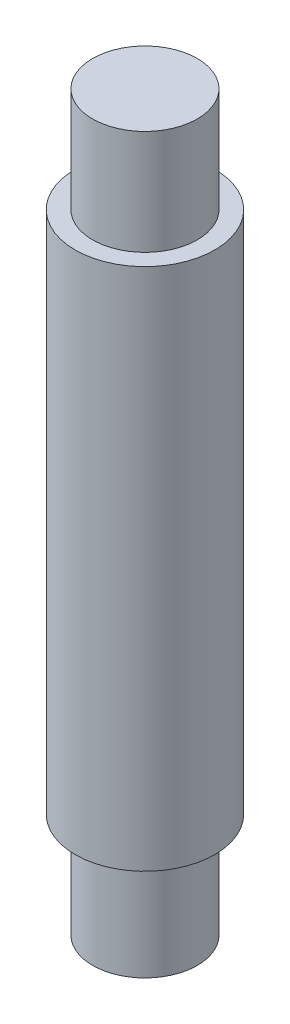
ISO-10303-21;
HEADER;
FILE_DESCRIPTION(('STEP AP214'),'2;1');
FILE_NAME('part.step','',(''),(''),'','','');
FILE_SCHEMA(('AUTOMOTIVE_DESIGN { 1 0 10303 214 1 1 1 1 }'));
ENDSEC;
DATA;
#1=APPLICATION_CONTEXT('core data for automotive mechanical design processes');
#2=APPLICATION_PROTOCOL_DEFINITION('international standard','automotive_design',2000,#1);
#3=PRODUCT_CONTEXT('',#1,'mechanical');
#4=PRODUCT('Part','Part','',(#3));
#5=PRODUCT_RELATED_PRODUCT_CATEGORY('part','',(#4));
#6=PRODUCT_DEFINITION_FORMATION('','',#4);
#7=PRODUCT_DEFINITION_CONTEXT('part definition',#1,'design');
#8=PRODUCT_DEFINITION('design','',#6,#7);
#9=PRODUCT_DEFINITION_SHAPE('','',#8);
#10=(LENGTH_UNIT() NAMED_UNIT(*) SI_UNIT(.MILLI.,.METRE.));
#11=(NAMED_UNIT(*) PLANE_ANGLE_UNIT() SI_UNIT($,.RADIAN.));
#12=(NAMED_UNIT(*) SI_UNIT($,.STERADIAN.) SOLID_ANGLE_UNIT());
#13=UNCERTAINTY_MEASURE_WITH_UNIT(LENGTH_MEASURE(1.E-05),#10,'distance_accuracy_value','');
#14=(GEOMETRIC_REPRESENTATION_CONTEXT(3) GLOBAL_UNCERTAINTY_ASSIGNED_CONTEXT((#13)) GLOBAL_UNIT_ASSIGNED_CONTEXT((#10,
#11,#12)) REPRESENTATION_CONTEXT('',''));
#15=CARTESIAN_POINT('',(0.,0.,0.));
#16=DIRECTION('',(0.,0.,1.));
#17=DIRECTION('',(1.,0.,0.));
#18=AXIS2_PLACEMENT_3D('',#15,#16,#17);
#19=CARTESIAN_POINT('',(0.,152.4,0.));
#20=DIRECTION('',(0.,-1.,0.));
#21=DIRECTION('',(0.,0.,-1.));
#22=AXIS2_PLACEMENT_3D('',#19,#20,#21);
#23=CYLINDRICAL_SURFACE('',#22,76.2);
#24=CARTESIAN_POINT('',(0.,152.4,0.));
#25=DIRECTION('',(0.,1.,0.));
#26=DIRECTION('',(0.,0.,1.));
#27=AXIS2_PLACEMENT_3D('',#24,#25,#26);
#28=CIRCLE('',#27,76.2);
#29=CARTESIAN_POINT('',(0.,152.4,-76.2));
#30=VERTEX_POINT('',#29);
#31=EDGE_CURVE('E40',#30,#30,#28,.T.);
#32=CARTESIAN_POINT('',(0.,0.,0.));
#33=DIRECTION('',(0.,1.,0.));
#34=DIRECTION('',(0.,0.,1.));
#35=AXIS2_PLACEMENT_3D('',#32,#33,#34);
#36=CIRCLE('',#35,76.2);
#37=CARTESIAN_POINT('',(0.,0.,-76.2));
#38=VERTEX_POINT('',#37);
#39=EDGE_CURVE('E36',#38,#38,#36,.T.);
#40=CARTESIAN_POINT('',(0.,152.4,-76.2));
#41=CARTESIAN_POINT('',(0.,150.8125,-76.2));
#42=CARTESIAN_POINT('',(0.,149.225,-76.2));
#43=CARTESIAN_POINT('',(0.,146.05,-76.2));
#44=CARTESIAN_POINT('',(0.,144.4625,-76.2));
#45=CARTESIAN_POINT('',(0.,141.2875,-76.2));
#46=CARTESIAN_POINT('',(0.,139.7,-76.2));
#47=CARTESIAN_POINT('',(0.,136.525,-76.2));
#48=CARTESIAN_POINT('',(0.,134.9375,-76.2));
#49=CARTESIAN_POINT('',(0.,131.7625,-76.2));
#50=CARTESIAN_POINT('',(0.,130.175,-76.2));
#51=CARTESIAN_POINT('',(0.,127.,-76.2));
#52=CARTESIAN_POINT('',(0.,125.4125,-76.2));
#53=CARTESIAN_POINT('',(0.,122.2375,-76.2));
#54=CARTESIAN_POINT('',(0.,120.65,-76.2));
#55=CARTESIAN_POINT('',(0.,117.475,-76.2));
#56=CARTESIAN_POINT('',(0.,115.8875,-76.2));
#57=CARTESIAN_POINT('',(0.,112.7125,-76.2));
#58=CARTESIAN_POINT('',(0.,111.125,-76.2));
#59=CARTESIAN_POINT('',(0.,107.95,-76.2));
#60=CARTESIAN_POINT('',(0.,106.3625,-76.2));
#61=CARTESIAN_POINT('',(0.,103.1875,-76.2));
#62=CARTESIAN_POINT('',(0.,101.6,-76.2));
#63=CARTESIAN_POINT('',(0.,98.425,-76.2));
#64=CARTESIAN_POINT('',(0.,96.8375,-76.2));
#65=CARTESIAN_POINT('',(0.,93.6625,-76.2));
#66=CARTESIAN_POINT('',(0.,92.075,-76.2));
#67=CARTESIAN_POINT('',(0.,88.9,-76.2));
#68=CARTESIAN_POINT('',(0.,87.3125,-76.2));
#69=CARTESIAN_POINT('',(0.,84.1375,-76.2));
#70=CARTESIAN_POINT('',(0.,82.55,-76.2));
#71=CARTESIAN_POINT('',(0.,79.375,-76.2));
#72=CARTESIAN_POINT('',(0.,77.7875,-76.2));
#73=CARTESIAN_POINT('',(0.,74.6125,-76.2));
#74=CARTESIAN_POINT('',(0.,73.025,-76.2));
#75=CARTESIAN_POINT('',(0.,69.85,-76.2));
#76=CARTESIAN_POINT('',(0.,68.2625,-76.2));
#77=CARTESIAN_POINT('',(0.,65.0875,-76.2));
#78=CARTESIAN_POINT('',(0.,63.5,-76.2));
#79=CARTESIAN_POINT('',(0.,60.325,-76.2));
#80=CARTESIAN_POINT('',(0.,58.7375,-76.2));
#81=CARTESIAN_POINT('',(0.,55.5625,-76.2));
#82=CARTESIAN_POINT('',(0.,53.975,-76.2));
#83=CARTESIAN_POINT('',(0.,50.8,-76.2));
#84=CARTESIAN_POINT('',(0.,49.2125,-76.2));
#85=CARTESIAN_POINT('',(0.,46.0375,-76.2));
#86=CARTESIAN_POINT('',(0.,44.45,-76.2));
#87=CARTESIAN_POINT('',(0.,41.275,-76.2));
#88=CARTESIAN_POINT('',(0.,39.6875,-76.2));
#89=CARTESIAN_POINT('',(0.,36.5125,-76.2));
#90=CARTESIAN_POINT('',(0.,34.925,-76.2));
#91=CARTESIAN_POINT('',(0.,31.75,-76.2));
#92=CARTESIAN_POINT('',(0.,30.1625,-76.2));
#93=CARTESIAN_POINT('',(0.,26.9875,-76.2));
#94=CARTESIAN_POINT('',(0.,25.4,-76.2));
#95=CARTESIAN_POINT('',(0.,22.225,-76.2));
#96=CARTESIAN_POINT('',(0.,20.6375,-76.2));
#97=CARTESIAN_POINT('',(0.,17.4625,-76.2));
#98=CARTESIAN_POINT('',(0.,15.875,-76.2));
#99=CARTESIAN_POINT('',(0.,12.7,-76.2));
#100=CARTESIAN_POINT('',(0.,11.1125,-76.2));
#101=CARTESIAN_POINT('',(0.,7.93750000000001,-76.2));
#102=CARTESIAN_POINT('',(0.,6.35,-76.2));
#103=CARTESIAN_POINT('',(0.,3.175,-76.2));
#104=CARTESIAN_POINT('',(0.,1.5875,-76.2));
#105=CARTESIAN_POINT('',(0.,0.,-76.2));
#106=B_SPLINE_CURVE_WITH_KNOTS('',3,(#40,#41,#42,#43,#44,#45,#46,#47,#48,#49,#50,#51,#52,#53,
#54,#55,#56,#57,#58,#59,#60,#61,#62,#63,#64,#65,#66,#67,#68,#69,#70,#71,#72,#73,#74,#75,#76,#77,
#78,#79,#80,#81,#82,#83,#84,#85,#86,#87,#88,#89,#90,#91,#92,#93,#94,#95,#96,#97,#98,#99,#100,
#101,#102,#103,#104,#105),.UNSPECIFIED.,.F.,.F.,(4,2,2,2,2,2,2,2,2,2,2,2,2,2,2,2,2,2,2,2,2,2,2,
2,2,2,2,2,2,2,2,2,4),(0.,4.7625,9.52500000000001,14.2875,19.05,23.8125,28.575,33.3375,38.1,
42.8625,47.625,52.3875,57.15,61.9125,66.675,71.4375,76.2,80.9625,85.725,90.4875,95.25,100.0125,
104.775,109.5375,114.3,119.0625,123.825,128.5875,133.35,138.1125,142.875,147.6375,152.4),.UNSPECIFIED.);
#107=EDGE_CURVE('BSEAM33',#30,#38,#106,.T.);
#108=ORIENTED_EDGE('',*,*,#31,.F.);
#109=ORIENTED_EDGE('',*,*,#39,.T.);
#110=ORIENTED_EDGE('',*,*,#107,.T.);
#111=ORIENTED_EDGE('',*,*,#107,.F.);
#112=EDGE_LOOP('',(#108,#110,#109,#111));
#113=FACE_BOUND('',#112,.T.);
#114=ADVANCED_FACE('F33',(#113),#23,.T.);
#115=CARTESIAN_POINT('',(0.,0.,0.));
#116=DIRECTION('',(0.,1.,0.));
#117=DIRECTION('',(0.,0.,1.));
#118=AXIS2_PLACEMENT_3D('',#115,#116,#117);
#119=PLANE('',#118);
#120=ORIENTED_EDGE('',*,*,#39,.F.);
#121=EDGE_LOOP('',(#120));
#122=FACE_BOUND('',#121,.T.);
#123=ADVANCED_FACE('F74',(#122),#119,.F.);
#124=CARTESIAN_POINT('',(0.,914.4,0.));
#125=DIRECTION('',(0.,-1.,0.));
#126=DIRECTION('',(0.,0.,-1.));
#127=AXIS2_PLACEMENT_3D('',#124,#125,#126);
#128=CYLINDRICAL_SURFACE('',#127,101.6);
#129=CARTESIAN_POINT('',(0.,914.4,0.));
#130=DIRECTION('',(0.,1.,0.));
#131=DIRECTION('',(0.,0.,1.));
#132=AXIS2_PLACEMENT_3D('',#129,#130,#131);
#133=CIRCLE('',#132,101.6);
#134=CARTESIAN_POINT('',(0.,914.4,101.6));
#135=VERTEX_POINT('',#134);
#136=EDGE_CURVE('E48',#135,#135,#133,.T.);
#137=ORIENTED_EDGE('',*,*,#136,.F.);
#138=EDGE_LOOP('',(#137));
#139=FACE_BOUND('',#138,.T.);
#140=CARTESIAN_POINT('',(0.,152.4,0.));
#141=DIRECTION('',(0.,1.,0.));
#142=DIRECTION('',(0.,0.,1.));
#143=AXIS2_PLACEMENT_3D('',#140,#141,#142);
#144=CIRCLE('',#143,101.6);
#145=CARTESIAN_POINT('',(0.,152.4,101.6));
#146=VERTEX_POINT('',#145);
#147=EDGE_CURVE('E51',#146,#146,#144,.T.);
#148=ORIENTED_EDGE('',*,*,#147,.T.);
#149=EDGE_LOOP('',(#148));
#150=FACE_BOUND('',#149,.T.);
#151=ADVANCED_FACE('F79',(#139,#150),#128,.T.);
#152=CARTESIAN_POINT('',(0.,914.4,0.));
#153=DIRECTION('',(0.,1.,0.));
#154=DIRECTION('',(0.,0.,1.));
#155=AXIS2_PLACEMENT_3D('',#152,#153,#154);
#156=PLANE('',#155);
#157=CARTESIAN_POINT('',(0.,914.4,0.));
#158=DIRECTION('',(0.,1.,0.));
#159=DIRECTION('',(0.,0.,1.));
#160=AXIS2_PLACEMENT_3D('',#157,#158,#159);
#161=CIRCLE('',#160,76.2);
#162=CARTESIAN_POINT('',(0.,914.4,-76.2));
#163=VERTEX_POINT('',#162);
#164=EDGE_CURVE('E10',#163,#163,#161,.T.);
#165=ORIENTED_EDGE('',*,*,#164,.F.);
#166=EDGE_LOOP('',(#165));
#167=FACE_BOUND('',#166,.T.);
#168=ORIENTED_EDGE('',*,*,#136,.T.);
#169=EDGE_LOOP('',(#168));
#170=FACE_BOUND('',#169,.T.);
#171=ADVANCED_FACE('F69',(#167,#170),#156,.T.);
#172=CARTESIAN_POINT('',(0.,152.4,0.));
#173=DIRECTION('',(0.,1.,0.));
#174=DIRECTION('',(0.,0.,1.));
#175=AXIS2_PLACEMENT_3D('',#172,#173,#174);
#176=PLANE('',#175);
#177=ORIENTED_EDGE('',*,*,#31,.T.);
#178=EDGE_LOOP('',(#177));
#179=FACE_BOUND('',#178,.T.);
#180=ORIENTED_EDGE('',*,*,#147,.F.);
#181=EDGE_LOOP('',(#180));
#182=FACE_BOUND('',#181,.T.);
#183=ADVANCED_FACE('F62',(#179,#182),#176,.F.);
#184=CARTESIAN_POINT('',(0.,1066.8,0.));
#185=DIRECTION('',(0.,-1.,0.));
#186=DIRECTION('',(0.,0.,-1.));
#187=AXIS2_PLACEMENT_3D('',#184,#185,#186);
#188=CYLINDRICAL_SURFACE('',#187,76.2);
#189=CARTESIAN_POINT('',(0.,1066.8,0.));
#190=DIRECTION('',(0.,1.,0.));
#191=DIRECTION('',(0.,0.,1.));
#192=AXIS2_PLACEMENT_3D('',#189,#190,#191);
#193=CIRCLE('',#192,76.2);
#194=CARTESIAN_POINT('',(0.,1066.8,-76.2));
#195=VERTEX_POINT('',#194);
#196=EDGE_CURVE('E47',#195,#195,#193,.T.);
#197=CARTESIAN_POINT('',(0.,1066.8,-76.2));
#198=CARTESIAN_POINT('',(0.,1065.2125,-76.2));
#199=CARTESIAN_POINT('',(0.,1063.625,-76.2));
#200=CARTESIAN_POINT('',(0.,1060.45,-76.2));
#201=CARTESIAN_POINT('',(0.,1058.8625,-76.2));
#202=CARTESIAN_POINT('',(0.,1055.6875,-76.2));
#203=CARTESIAN_POINT('',(0.,1054.1,-76.2));
#204=CARTESIAN_POINT('',(0.,1050.925,-76.2));
#205=CARTESIAN_POINT('',(0.,1049.3375,-76.2));
#206=CARTESIAN_POINT('',(0.,1046.1625,-76.2));
#207=CARTESIAN_POINT('',(0.,1044.575,-76.2));
#208=CARTESIAN_POINT('',(0.,1041.4,-76.2));
#209=CARTESIAN_POINT('',(0.,1039.8125,-76.2));
#210=CARTESIAN_POINT('',(0.,1036.6375,-76.2));
#211=CARTESIAN_POINT('',(0.,1035.05,-76.2));
#212=CARTESIAN_POINT('',(0.,1031.875,-76.2));
#213=CARTESIAN_POINT('',(0.,1030.2875,-76.2));
#214=CARTESIAN_POINT('',(0.,1027.1125,-76.2));
#215=CARTESIAN_POINT('',(0.,1025.525,-76.2));
#216=CARTESIAN_POINT('',(0.,1022.35,-76.2));
#217=CARTESIAN_POINT('',(0.,1020.7625,-76.2));
#218=CARTESIAN_POINT('',(0.,1017.5875,-76.2));
#219=CARTESIAN_POINT('',(0.,1016.,-76.2));
#220=CARTESIAN_POINT('',(0.,1012.825,-76.2));
#221=CARTESIAN_POINT('',(0.,1011.2375,-76.2));
#222=CARTESIAN_POINT('',(0.,1008.0625,-76.2));
#223=CARTESIAN_POINT('',(0.,1006.475,-76.2));
#224=CARTESIAN_POINT('',(0.,1003.3,-76.2));
#225=CARTESIAN_POINT('',(0.,1001.7125,-76.2));
#226=CARTESIAN_POINT('',(0.,998.5375,-76.2));
#227=CARTESIAN_POINT('',(0.,996.95,-76.2));
#228=CARTESIAN_POINT('',(0.,993.775,-76.2));
#229=CARTESIAN_POINT('',(0.,992.1875,-76.2));
#230=CARTESIAN_POINT('',(0.,989.0125,-76.2));
#231=CARTESIAN_POINT('',(0.,987.425,-76.2));
#232=CARTESIAN_POINT('',(0.,984.25,-76.2));
#233=CARTESIAN_POINT('',(0.,982.6625,-76.2));
#234=CARTESIAN_POINT('',(0.,979.4875,-76.2));
#235=CARTESIAN_POINT('',(0.,977.9,-76.2));
#236=CARTESIAN_POINT('',(0.,974.725,-76.2));
#237=CARTESIAN_POINT('',(0.,973.1375,-76.2));
#238=CARTESIAN_POINT('',(0.,969.9625,-76.2));
#239=CARTESIAN_POINT('',(0.,968.375,-76.2));
#240=CARTESIAN_POINT('',(0.,965.2,-76.2));
#241=CARTESIAN_POINT('',(0.,963.6125,-76.2));
#242=CARTESIAN_POINT('',(0.,960.4375,-76.2));
#243=CARTESIAN_POINT('',(0.,958.85,-76.2));
#244=CARTESIAN_POINT('',(0.,955.675,-76.2));
#245=CARTESIAN_POINT('',(0.,954.0875,-76.2));
#246=CARTESIAN_POINT('',(0.,950.9125,-76.2));
#247=CARTESIAN_POINT('',(0.,949.325,-76.2));
#248=CARTESIAN_POINT('',(0.,946.15,-76.2));
#249=CARTESIAN_POINT('',(0.,944.5625,-76.2));
#250=CARTESIAN_POINT('',(0.,941.3875,-76.2));
#251=CARTESIAN_POINT('',(0.,939.8,-76.2));
#252=CARTESIAN_POINT('',(0.,936.625,-76.2));
#253=CARTESIAN_POINT('',(0.,935.0375,-76.2));
#254=CARTESIAN_POINT('',(0.,931.8625,-76.2));
#255=CARTESIAN_POINT('',(0.,930.275,-76.2));
#256=CARTESIAN_POINT('',(0.,927.1,-76.2));
#257=CARTESIAN_POINT('',(0.,925.5125,-76.2));
#258=CARTESIAN_POINT('',(0.,922.3375,-76.2));
#259=CARTESIAN_POINT('',(0.,920.75,-76.2));
#260=CARTESIAN_POINT('',(0.,917.575,-76.2));
#261=CARTESIAN_POINT('',(0.,915.9875,-76.2));
#262=CARTESIAN_POINT('',(0.,914.4,-76.2));
#263=B_SPLINE_CURVE_WITH_KNOTS('',3,(#197,#198,#199,#200,#201,#202,#203,#204,#205,#206,#207,
#208,#209,#210,#211,#212,#213,#214,#215,#216,#217,#218,#219,#220,#221,#222,#223,#224,#225,#226,
#227,#228,#229,#230,#231,#232,#233,#234,#235,#236,#237,#238,#239,#240,#241,#242,#243,#244,#245,
#246,#247,#248,#249,#250,#251,#252,#253,#254,#255,#256,#257,#258,#259,#260,#261,#262),
.UNSPECIFIED.,.F.,.F.,(4,2,2,2,2,2,2,2,2,2,2,2,2,2,2,2,2,2,2,2,2,2,2,2,2,2,2,2,2,2,2,2,4),(0.,
4.7625,9.52500000000001,14.2875,19.05,23.8125,28.575,33.3375,38.1,42.8625,47.625,52.3875,57.15,
61.9125,66.675,71.4375,76.2,80.9625,85.7250000000001,90.4875000000001,95.2500000000001,100.0125,
104.775,109.5375,114.3,119.0625,123.825,128.5875,133.35,138.1125,142.875,147.6375,152.4),.UNSPECIFIED.);
#264=EDGE_CURVE('BSEAM60',#195,#163,#263,.T.);
#265=ORIENTED_EDGE('',*,*,#196,.F.);
#266=ORIENTED_EDGE('',*,*,#164,.T.);
#267=ORIENTED_EDGE('',*,*,#264,.T.);
#268=ORIENTED_EDGE('',*,*,#264,.F.);
#269=EDGE_LOOP('',(#265,#267,#266,#268));
#270=FACE_BOUND('',#269,.T.);
#271=ADVANCED_FACE('F60',(#270),#188,.T.);
#272=CARTESIAN_POINT('',(0.,1066.8,0.));
#273=DIRECTION('',(0.,1.,0.));
#274=DIRECTION('',(0.,0.,1.));
#275=AXIS2_PLACEMENT_3D('',#272,#273,#274);
#276=PLANE('',#275);
#277=ORIENTED_EDGE('',*,*,#196,.T.);
#278=EDGE_LOOP('',(#277));
#279=FACE_BOUND('',#278,.T.);
#280=ADVANCED_FACE('F58',(#279),#276,.T.);
#281=CLOSED_SHELL('',(#114,#123,#151,#171,#183,#271,#280));
#282=MANIFOLD_SOLID_BREP('B2',#281);
#283=ADVANCED_BREP_SHAPE_REPRESENTATION('',(#18,#282),#14);
#284=SHAPE_DEFINITION_REPRESENTATION(#9,#283);
ENDSEC;
END-ISO-10303-21;
